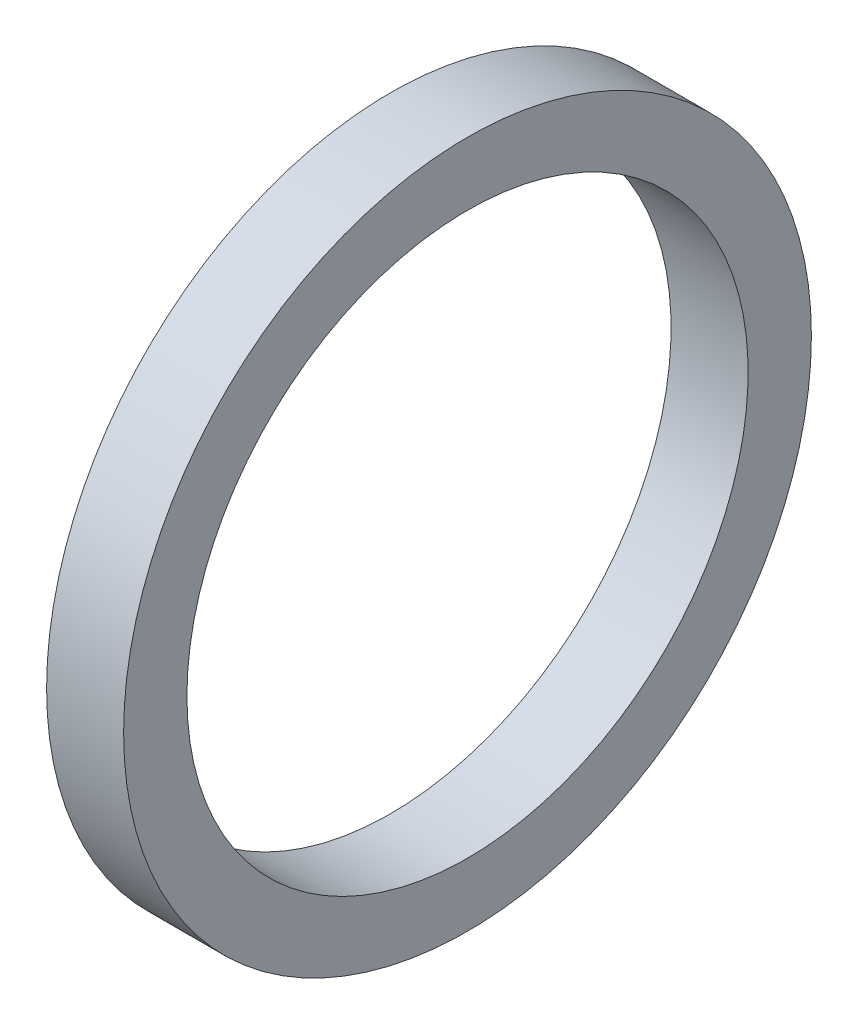
ISO-10303-21;
HEADER;
FILE_DESCRIPTION(('STEP AP214'),'2;1');
FILE_NAME('part.step','',(''),(''),'','','');
FILE_SCHEMA(('AUTOMOTIVE_DESIGN { 1 0 10303 214 1 1 1 1 }'));
ENDSEC;
DATA;
#1=APPLICATION_CONTEXT('core data for automotive mechanical design processes');
#2=APPLICATION_PROTOCOL_DEFINITION('international standard','automotive_design',2000,#1);
#3=PRODUCT_CONTEXT('',#1,'mechanical');
#4=PRODUCT('Part','Part','',(#3));
#5=PRODUCT_RELATED_PRODUCT_CATEGORY('part','',(#4));
#6=PRODUCT_DEFINITION_FORMATION('','',#4);
#7=PRODUCT_DEFINITION_CONTEXT('part definition',#1,'design');
#8=PRODUCT_DEFINITION('design','',#6,#7);
#9=PRODUCT_DEFINITION_SHAPE('','',#8);
#10=(LENGTH_UNIT() NAMED_UNIT(*) SI_UNIT(.MILLI.,.METRE.));
#11=(NAMED_UNIT(*) PLANE_ANGLE_UNIT() SI_UNIT($,.RADIAN.));
#12=(NAMED_UNIT(*) SI_UNIT($,.STERADIAN.) SOLID_ANGLE_UNIT());
#13=UNCERTAINTY_MEASURE_WITH_UNIT(LENGTH_MEASURE(1.E-05),#10,'distance_accuracy_value','');
#14=(GEOMETRIC_REPRESENTATION_CONTEXT(3) GLOBAL_UNCERTAINTY_ASSIGNED_CONTEXT((#13)) GLOBAL_UNIT_ASSIGNED_CONTEXT((#10,
#11,#12)) REPRESENTATION_CONTEXT('',''));
#15=CARTESIAN_POINT('',(0.,0.,0.));
#16=DIRECTION('',(0.,0.,1.));
#17=DIRECTION('',(1.,0.,0.));
#18=AXIS2_PLACEMENT_3D('',#15,#16,#17);
#19=CARTESIAN_POINT('',(-34.9249999999999,0.,0.));
#20=DIRECTION('',(-1.,0.,0.));
#21=DIRECTION('',(0.,0.,1.));
#22=AXIS2_PLACEMENT_3D('',#19,#20,#21);
#23=CYLINDRICAL_SURFACE('',#22,51.);
#24=CARTESIAN_POINT('',(0.,0.,0.));
#25=DIRECTION('',(-1.,0.,0.));
#26=DIRECTION('',(0.,0.,1.));
#27=AXIS2_PLACEMENT_3D('',#24,#25,#26);
#28=CIRCLE('',#27,51.);
#29=CARTESIAN_POINT('',(0.,0.,51.));
#30=VERTEX_POINT('',#29);
#31=EDGE_CURVE('E10',#30,#30,#28,.T.);
#32=ORIENTED_EDGE('',*,*,#31,.F.);
#33=EDGE_LOOP('',(#32));
#34=FACE_BOUND('',#33,.T.);
#35=CARTESIAN_POINT('',(-14.,0.,0.));
#36=DIRECTION('',(-1.,0.,0.));
#37=DIRECTION('',(0.,0.,1.));
#38=AXIS2_PLACEMENT_3D('',#35,#36,#37);
#39=CIRCLE('',#38,51.);
#40=CARTESIAN_POINT('',(-14.,0.,51.));
#41=VERTEX_POINT('',#40);
#42=EDGE_CURVE('E44',#41,#41,#39,.T.);
#43=ORIENTED_EDGE('',*,*,#42,.T.);
#44=EDGE_LOOP('',(#43));
#45=FACE_BOUND('',#44,.T.);
#46=ADVANCED_FACE('F30',(#34,#45),#23,.F.);
#47=CARTESIAN_POINT('',(0.,51.,0.));
#48=DIRECTION('',(-1.,0.,0.));
#49=DIRECTION('',(0.,0.,1.));
#50=AXIS2_PLACEMENT_3D('',#47,#48,#49);
#51=PLANE('',#50);
#52=CARTESIAN_POINT('',(0.,0.,0.));
#53=DIRECTION('',(-1.,0.,0.));
#54=DIRECTION('',(0.,0.,1.));
#55=AXIS2_PLACEMENT_3D('',#52,#53,#54);
#56=CIRCLE('',#55,62.5);
#57=CARTESIAN_POINT('',(0.,0.,62.5));
#58=VERTEX_POINT('',#57);
#59=EDGE_CURVE('E36',#58,#58,#56,.T.);
#60=ORIENTED_EDGE('',*,*,#59,.F.);
#61=EDGE_LOOP('',(#60));
#62=FACE_BOUND('',#61,.T.);
#63=ORIENTED_EDGE('',*,*,#31,.T.);
#64=EDGE_LOOP('',(#63));
#65=FACE_BOUND('',#64,.T.);
#66=ADVANCED_FACE('F59',(#62,#65),#51,.F.);
#67=CARTESIAN_POINT('',(-34.9249999999999,0.,0.));
#68=DIRECTION('',(-1.,0.,0.));
#69=DIRECTION('',(0.,0.,1.));
#70=AXIS2_PLACEMENT_3D('',#67,#68,#69);
#71=CYLINDRICAL_SURFACE('',#70,62.5);
#72=CARTESIAN_POINT('',(-14.,0.,0.));
#73=DIRECTION('',(-1.,0.,0.));
#74=DIRECTION('',(0.,0.,1.));
#75=AXIS2_PLACEMENT_3D('',#72,#73,#74);
#76=CIRCLE('',#75,62.5);
#77=CARTESIAN_POINT('',(-14.,0.,62.5));
#78=VERTEX_POINT('',#77);
#79=EDGE_CURVE('E40',#78,#78,#76,.T.);
#80=ORIENTED_EDGE('',*,*,#79,.F.);
#81=EDGE_LOOP('',(#80));
#82=FACE_BOUND('',#81,.T.);
#83=ORIENTED_EDGE('',*,*,#59,.T.);
#84=EDGE_LOOP('',(#83));
#85=FACE_BOUND('',#84,.T.);
#86=ADVANCED_FACE('F54',(#82,#85),#71,.T.);
#87=CARTESIAN_POINT('',(-14.,62.5,0.));
#88=DIRECTION('',(1.,0.,0.));
#89=DIRECTION('',(0.,0.,-1.));
#90=AXIS2_PLACEMENT_3D('',#87,#88,#89);
#91=PLANE('',#90);
#92=ORIENTED_EDGE('',*,*,#42,.F.);
#93=EDGE_LOOP('',(#92));
#94=FACE_BOUND('',#93,.T.);
#95=ORIENTED_EDGE('',*,*,#79,.T.);
#96=EDGE_LOOP('',(#95));
#97=FACE_BOUND('',#96,.T.);
#98=ADVANCED_FACE('F51',(#94,#97),#91,.F.);
#99=CLOSED_SHELL('',(#46,#66,#86,#98));
#100=MANIFOLD_SOLID_BREP('B2',#99);
#101=ADVANCED_BREP_SHAPE_REPRESENTATION('',(#18,#100),#14);
#102=SHAPE_DEFINITION_REPRESENTATION(#9,#101);
ENDSEC;
END-ISO-10303-21;
